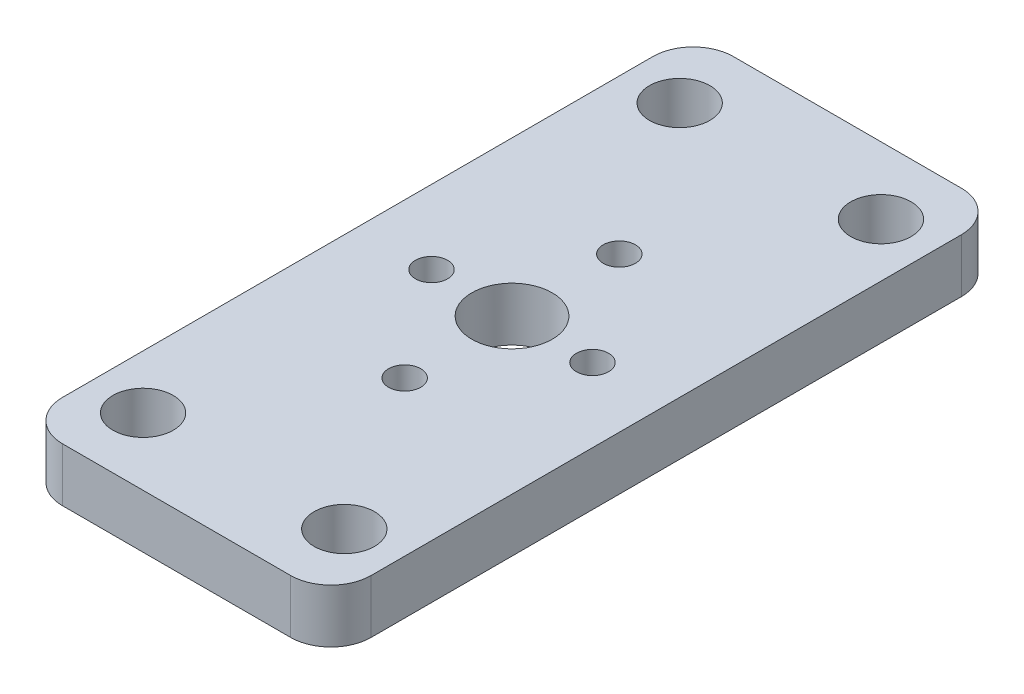
ISO-10303-21;
HEADER;
FILE_DESCRIPTION(('STEP AP214'),'2;1');
FILE_NAME('part.step','',(''),(''),'','','');
FILE_SCHEMA(('AUTOMOTIVE_DESIGN { 1 0 10303 214 1 1 1 1 }'));
ENDSEC;
DATA;
#1=APPLICATION_CONTEXT('core data for automotive mechanical design processes');
#2=APPLICATION_PROTOCOL_DEFINITION('international standard','automotive_design',2000,#1);
#3=PRODUCT_CONTEXT('',#1,'mechanical');
#4=PRODUCT('Part','Part','',(#3));
#5=PRODUCT_RELATED_PRODUCT_CATEGORY('part','',(#4));
#6=PRODUCT_DEFINITION_FORMATION('','',#4);
#7=PRODUCT_DEFINITION_CONTEXT('part definition',#1,'design');
#8=PRODUCT_DEFINITION('design','',#6,#7);
#9=PRODUCT_DEFINITION_SHAPE('','',#8);
#10=(LENGTH_UNIT() NAMED_UNIT(*) SI_UNIT(.MILLI.,.METRE.));
#11=(NAMED_UNIT(*) PLANE_ANGLE_UNIT() SI_UNIT($,.RADIAN.));
#12=(NAMED_UNIT(*) SI_UNIT($,.STERADIAN.) SOLID_ANGLE_UNIT());
#13=UNCERTAINTY_MEASURE_WITH_UNIT(LENGTH_MEASURE(1.E-05),#10,'distance_accuracy_value','');
#14=(GEOMETRIC_REPRESENTATION_CONTEXT(3) GLOBAL_UNCERTAINTY_ASSIGNED_CONTEXT((#13)) GLOBAL_UNIT_ASSIGNED_CONTEXT((#10,
#11,#12)) REPRESENTATION_CONTEXT('',''));
#15=CARTESIAN_POINT('',(0.,0.,0.));
#16=DIRECTION('',(0.,0.,1.));
#17=DIRECTION('',(1.,0.,0.));
#18=AXIS2_PLACEMENT_3D('',#15,#16,#17);
#19=CARTESIAN_POINT('',(0.,4.,0.));
#20=DIRECTION('',(0.,-1.,0.));
#21=DIRECTION('',(0.,0.,-1.));
#22=AXIS2_PLACEMENT_3D('',#19,#20,#21);
#23=PLANE('',#22);
#24=CARTESIAN_POINT('',(0.,4.,8.));
#25=DIRECTION('',(0.,-1.,0.));
#26=DIRECTION('',(0.,0.,-1.));
#27=AXIS2_PLACEMENT_3D('',#24,#25,#26);
#28=CIRCLE('',#27,1.2);
#29=CARTESIAN_POINT('',(0.,4.,6.8));
#30=VERTEX_POINT('',#29);
#31=EDGE_CURVE('E309',#30,#30,#28,.T.);
#32=ORIENTED_EDGE('',*,*,#31,.T.);
#33=EDGE_LOOP('',(#32));
#34=FACE_BOUND('',#33,.T.);
#35=CARTESIAN_POINT('',(6.,4.,0.));
#36=DIRECTION('',(0.,-1.,0.));
#37=DIRECTION('',(0.,0.,-1.));
#38=AXIS2_PLACEMENT_3D('',#35,#36,#37);
#39=CIRCLE('',#38,1.2);
#40=CARTESIAN_POINT('',(6.,4.,-1.2));
#41=VERTEX_POINT('',#40);
#42=EDGE_CURVE('E324',#41,#41,#39,.T.);
#43=ORIENTED_EDGE('',*,*,#42,.T.);
#44=EDGE_LOOP('',(#43));
#45=FACE_BOUND('',#44,.T.);
#46=CARTESIAN_POINT('',(0.,4.,-8.));
#47=DIRECTION('',(0.,-1.,0.));
#48=DIRECTION('',(0.,0.,-1.));
#49=AXIS2_PLACEMENT_3D('',#46,#47,#48);
#50=CIRCLE('',#49,1.2);
#51=CARTESIAN_POINT('',(0.,4.,-9.2));
#52=VERTEX_POINT('',#51);
#53=EDGE_CURVE('E340',#52,#52,#50,.T.);
#54=ORIENTED_EDGE('',*,*,#53,.T.);
#55=EDGE_LOOP('',(#54));
#56=FACE_BOUND('',#55,.T.);
#57=CARTESIAN_POINT('',(-6.,4.,0.));
#58=DIRECTION('',(0.,-1.,0.));
#59=DIRECTION('',(0.,0.,-1.));
#60=AXIS2_PLACEMENT_3D('',#57,#58,#59);
#61=CIRCLE('',#60,1.2);
#62=CARTESIAN_POINT('',(-6.,4.,-1.2));
#63=VERTEX_POINT('',#62);
#64=EDGE_CURVE('E356',#63,#63,#61,.T.);
#65=ORIENTED_EDGE('',*,*,#64,.T.);
#66=EDGE_LOOP('',(#65));
#67=FACE_BOUND('',#66,.T.);
#68=CARTESIAN_POINT('',(0.,4.,0.));
#69=DIRECTION('',(0.,-1.,0.));
#70=DIRECTION('',(0.,0.,-1.));
#71=AXIS2_PLACEMENT_3D('',#68,#69,#70);
#72=CIRCLE('',#71,3.);
#73=CARTESIAN_POINT('',(0.,4.,-3.));
#74=VERTEX_POINT('',#73);
#75=EDGE_CURVE('E364',#74,#74,#72,.F.);
#76=ORIENTED_EDGE('',*,*,#75,.F.);
#77=EDGE_LOOP('',(#76));
#78=FACE_BOUND('',#77,.T.);
#79=CARTESIAN_POINT('',(7.50000000000001,4.,-20.));
#80=DIRECTION('',(0.,1.,0.));
#81=DIRECTION('',(0.,0.,1.));
#82=AXIS2_PLACEMENT_3D('',#79,#80,#81);
#83=CIRCLE('',#82,2.25);
#84=CARTESIAN_POINT('',(7.50000000000001,4.,-17.75));
#85=VERTEX_POINT('',#84);
#86=EDGE_CURVE('E376',#85,#85,#83,.T.);
#87=ORIENTED_EDGE('',*,*,#86,.F.);
#88=EDGE_LOOP('',(#87));
#89=FACE_BOUND('',#88,.T.);
#90=CARTESIAN_POINT('',(-7.5,4.,20.));
#91=DIRECTION('',(0.,1.,0.));
#92=DIRECTION('',(0.,0.,1.));
#93=AXIS2_PLACEMENT_3D('',#90,#91,#92);
#94=CIRCLE('',#93,2.25);
#95=CARTESIAN_POINT('',(-7.5,4.,22.25));
#96=VERTEX_POINT('',#95);
#97=EDGE_CURVE('E384',#96,#96,#94,.T.);
#98=ORIENTED_EDGE('',*,*,#97,.F.);
#99=EDGE_LOOP('',(#98));
#100=FACE_BOUND('',#99,.T.);
#101=DIRECTION('',(0.,0.,1.));
#102=VECTOR('',#101,1.);
#103=CARTESIAN_POINT('',(-11.5,4.,25.));
#104=LINE('',#103,#102);
#105=CARTESIAN_POINT('',(-11.5,4.,-22.));
#106=VERTEX_POINT('',#105);
#107=CARTESIAN_POINT('',(-11.5,4.,22.));
#108=VERTEX_POINT('',#107);
#109=EDGE_CURVE('E180',#106,#108,#104,.T.);
#110=ORIENTED_EDGE('',*,*,#109,.T.);
#111=CARTESIAN_POINT('',(-8.49999999999999,4.,22.));
#112=DIRECTION('',(0.,-1.,0.));
#113=DIRECTION('',(0.,0.,-1.));
#114=AXIS2_PLACEMENT_3D('',#111,#112,#113);
#115=CIRCLE('',#114,3.);
#116=CARTESIAN_POINT('',(-8.49999999999999,4.,25.));
#117=VERTEX_POINT('',#116);
#118=EDGE_CURVE('E168',#108,#117,#115,.F.);
#119=ORIENTED_EDGE('',*,*,#118,.T.);
#120=DIRECTION('',(1.,0.,0.));
#121=VECTOR('',#120,1.);
#122=CARTESIAN_POINT('',(-11.5,4.,25.));
#123=LINE('',#122,#121);
#124=CARTESIAN_POINT('',(8.5,4.,25.));
#125=VERTEX_POINT('',#124);
#126=EDGE_CURVE('E126',#117,#125,#123,.T.);
#127=ORIENTED_EDGE('',*,*,#126,.T.);
#128=CARTESIAN_POINT('',(8.5,4.,22.));
#129=DIRECTION('',(0.,-1.,0.));
#130=DIRECTION('',(0.,0.,-1.));
#131=AXIS2_PLACEMENT_3D('',#128,#129,#130);
#132=CIRCLE('',#131,3.);
#133=CARTESIAN_POINT('',(11.5,4.,22.));
#134=VERTEX_POINT('',#133);
#135=EDGE_CURVE('E165',#125,#134,#132,.F.);
#136=ORIENTED_EDGE('',*,*,#135,.T.);
#137=DIRECTION('',(0.,0.,-1.));
#138=VECTOR('',#137,1.);
#139=CARTESIAN_POINT('',(11.5,4.,25.));
#140=LINE('',#139,#138);
#141=CARTESIAN_POINT('',(11.5,4.,-22.));
#142=VERTEX_POINT('',#141);
#143=EDGE_CURVE('E135',#134,#142,#140,.T.);
#144=ORIENTED_EDGE('',*,*,#143,.T.);
#145=CARTESIAN_POINT('',(8.5,4.,-22.));
#146=DIRECTION('',(0.,-1.,0.));
#147=DIRECTION('',(0.,0.,-1.));
#148=AXIS2_PLACEMENT_3D('',#145,#146,#147);
#149=CIRCLE('',#148,3.);
#150=CARTESIAN_POINT('',(8.5,4.,-25.));
#151=VERTEX_POINT('',#150);
#152=EDGE_CURVE('E60',#142,#151,#149,.F.);
#153=ORIENTED_EDGE('',*,*,#152,.T.);
#154=DIRECTION('',(-1.,0.,0.));
#155=VECTOR('',#154,1.);
#156=CARTESIAN_POINT('',(-11.5,4.,-25.));
#157=LINE('',#156,#155);
#158=CARTESIAN_POINT('',(-8.49999999999999,4.,-25.));
#159=VERTEX_POINT('',#158);
#160=EDGE_CURVE('E140',#151,#159,#157,.T.);
#161=ORIENTED_EDGE('',*,*,#160,.T.);
#162=CARTESIAN_POINT('',(-8.49999999999999,4.,-22.));
#163=DIRECTION('',(0.,-1.,0.));
#164=DIRECTION('',(0.,0.,-1.));
#165=AXIS2_PLACEMENT_3D('',#162,#163,#164);
#166=CIRCLE('',#165,3.);
#167=EDGE_CURVE('E160',#159,#106,#166,.F.);
#168=ORIENTED_EDGE('',*,*,#167,.T.);
#169=EDGE_LOOP('',(#110,#119,#127,#136,#144,#153,#161,#168));
#170=FACE_BOUND('',#169,.T.);
#171=CARTESIAN_POINT('',(7.50000000000001,4.,20.));
#172=DIRECTION('',(0.,1.,0.));
#173=DIRECTION('',(0.,0.,1.));
#174=AXIS2_PLACEMENT_3D('',#171,#172,#173);
#175=CIRCLE('',#174,2.25);
#176=CARTESIAN_POINT('',(7.50000000000001,4.,22.25));
#177=VERTEX_POINT('',#176);
#178=EDGE_CURVE('E392',#177,#177,#175,.T.);
#179=ORIENTED_EDGE('',*,*,#178,.F.);
#180=EDGE_LOOP('',(#179));
#181=FACE_BOUND('',#180,.T.);
#182=CARTESIAN_POINT('',(-7.5,4.,-20.));
#183=DIRECTION('',(0.,1.,0.));
#184=DIRECTION('',(0.,0.,1.));
#185=AXIS2_PLACEMENT_3D('',#182,#183,#184);
#186=CIRCLE('',#185,2.25);
#187=CARTESIAN_POINT('',(-7.5,4.,-17.75));
#188=VERTEX_POINT('',#187);
#189=EDGE_CURVE('E368',#188,#188,#186,.T.);
#190=ORIENTED_EDGE('',*,*,#189,.F.);
#191=EDGE_LOOP('',(#190));
#192=FACE_BOUND('',#191,.T.);
#193=ADVANCED_FACE('F38',(#34,#45,#56,#67,#78,#89,#100,#170,#181,#192),#23,.F.);
#194=CARTESIAN_POINT('',(0.,0.,0.));
#195=DIRECTION('',(0.,-1.,0.));
#196=DIRECTION('',(0.,0.,-1.));
#197=AXIS2_PLACEMENT_3D('',#194,#195,#196);
#198=PLANE('',#197);
#199=CARTESIAN_POINT('',(0.,0.,8.));
#200=DIRECTION('',(0.,-1.,0.));
#201=DIRECTION('',(0.,0.,-1.));
#202=AXIS2_PLACEMENT_3D('',#199,#200,#201);
#203=CIRCLE('',#202,2.5);
#204=CARTESIAN_POINT('',(0.,0.,5.5));
#205=VERTEX_POINT('',#204);
#206=EDGE_CURVE('E299',#205,#205,#203,.T.);
#207=ORIENTED_EDGE('',*,*,#206,.F.);
#208=EDGE_LOOP('',(#207));
#209=FACE_BOUND('',#208,.T.);
#210=CARTESIAN_POINT('',(6.,0.,0.));
#211=DIRECTION('',(0.,-1.,0.));
#212=DIRECTION('',(0.,0.,-1.));
#213=AXIS2_PLACEMENT_3D('',#210,#211,#212);
#214=CIRCLE('',#213,2.5);
#215=CARTESIAN_POINT('',(6.,0.,-2.5));
#216=VERTEX_POINT('',#215);
#217=EDGE_CURVE('E312',#216,#216,#214,.T.);
#218=ORIENTED_EDGE('',*,*,#217,.F.);
#219=EDGE_LOOP('',(#218));
#220=FACE_BOUND('',#219,.T.);
#221=CARTESIAN_POINT('',(0.,0.,-8.));
#222=DIRECTION('',(0.,-1.,0.));
#223=DIRECTION('',(0.,0.,-1.));
#224=AXIS2_PLACEMENT_3D('',#221,#222,#223);
#225=CIRCLE('',#224,2.5);
#226=CARTESIAN_POINT('',(0.,0.,-10.5));
#227=VERTEX_POINT('',#226);
#228=EDGE_CURVE('E328',#227,#227,#225,.T.);
#229=ORIENTED_EDGE('',*,*,#228,.F.);
#230=EDGE_LOOP('',(#229));
#231=FACE_BOUND('',#230,.T.);
#232=CARTESIAN_POINT('',(-6.,0.,0.));
#233=DIRECTION('',(0.,-1.,0.));
#234=DIRECTION('',(0.,0.,-1.));
#235=AXIS2_PLACEMENT_3D('',#232,#233,#234);
#236=CIRCLE('',#235,2.5);
#237=CARTESIAN_POINT('',(-6.,0.,-2.5));
#238=VERTEX_POINT('',#237);
#239=EDGE_CURVE('E344',#238,#238,#236,.T.);
#240=ORIENTED_EDGE('',*,*,#239,.F.);
#241=EDGE_LOOP('',(#240));
#242=FACE_BOUND('',#241,.T.);
#243=CARTESIAN_POINT('',(0.,0.,0.));
#244=DIRECTION('',(0.,1.,0.));
#245=DIRECTION('',(0.,0.,1.));
#246=AXIS2_PLACEMENT_3D('',#243,#244,#245);
#247=CIRCLE('',#246,3.);
#248=CARTESIAN_POINT('',(0.,0.,3.));
#249=VERTEX_POINT('',#248);
#250=EDGE_CURVE('E360',#249,#249,#247,.T.);
#251=ORIENTED_EDGE('',*,*,#250,.T.);
#252=EDGE_LOOP('',(#251));
#253=FACE_BOUND('',#252,.T.);
#254=CARTESIAN_POINT('',(-7.5,0.,-20.));
#255=DIRECTION('',(0.,1.,0.));
#256=DIRECTION('',(0.,0.,1.));
#257=AXIS2_PLACEMENT_3D('',#254,#255,#256);
#258=CIRCLE('',#257,2.25);
#259=CARTESIAN_POINT('',(-7.5,0.,-17.75));
#260=VERTEX_POINT('',#259);
#261=EDGE_CURVE('E372',#260,#260,#258,.T.);
#262=ORIENTED_EDGE('',*,*,#261,.T.);
#263=EDGE_LOOP('',(#262));
#264=FACE_BOUND('',#263,.T.);
#265=CARTESIAN_POINT('',(7.50000000000001,0.,-20.));
#266=DIRECTION('',(0.,1.,0.));
#267=DIRECTION('',(0.,0.,1.));
#268=AXIS2_PLACEMENT_3D('',#265,#266,#267);
#269=CIRCLE('',#268,2.25);
#270=CARTESIAN_POINT('',(7.50000000000001,0.,-17.75));
#271=VERTEX_POINT('',#270);
#272=EDGE_CURVE('E380',#271,#271,#269,.T.);
#273=ORIENTED_EDGE('',*,*,#272,.T.);
#274=EDGE_LOOP('',(#273));
#275=FACE_BOUND('',#274,.T.);
#276=CARTESIAN_POINT('',(-7.5,0.,20.));
#277=DIRECTION('',(0.,1.,0.));
#278=DIRECTION('',(0.,0.,1.));
#279=AXIS2_PLACEMENT_3D('',#276,#277,#278);
#280=CIRCLE('',#279,2.25);
#281=CARTESIAN_POINT('',(-7.5,0.,22.25));
#282=VERTEX_POINT('',#281);
#283=EDGE_CURVE('E388',#282,#282,#280,.T.);
#284=ORIENTED_EDGE('',*,*,#283,.T.);
#285=EDGE_LOOP('',(#284));
#286=FACE_BOUND('',#285,.T.);
#287=DIRECTION('',(1.,0.,0.));
#288=VECTOR('',#287,1.);
#289=CARTESIAN_POINT('',(-11.5,0.,25.));
#290=LINE('',#289,#288);
#291=CARTESIAN_POINT('',(-8.49999999999999,0.,25.));
#292=VERTEX_POINT('',#291);
#293=CARTESIAN_POINT('',(8.5,0.,25.));
#294=VERTEX_POINT('',#293);
#295=EDGE_CURVE('E123',#292,#294,#290,.T.);
#296=ORIENTED_EDGE('',*,*,#295,.F.);
#297=CARTESIAN_POINT('',(-8.49999999999999,0.,22.));
#298=DIRECTION('',(0.,-1.,0.));
#299=DIRECTION('',(0.,0.,-1.));
#300=AXIS2_PLACEMENT_3D('',#297,#298,#299);
#301=CIRCLE('',#300,3.);
#302=CARTESIAN_POINT('',(-11.5,0.,22.));
#303=VERTEX_POINT('',#302);
#304=EDGE_CURVE('E105',#292,#303,#301,.T.);
#305=ORIENTED_EDGE('',*,*,#304,.T.);
#306=DIRECTION('',(0.,0.,1.));
#307=VECTOR('',#306,1.);
#308=CARTESIAN_POINT('',(-11.5,0.,25.));
#309=LINE('',#308,#307);
#310=CARTESIAN_POINT('',(-11.5,0.,-22.));
#311=VERTEX_POINT('',#310);
#312=EDGE_CURVE('E136',#311,#303,#309,.T.);
#313=ORIENTED_EDGE('',*,*,#312,.F.);
#314=CARTESIAN_POINT('',(-8.49999999999999,0.,-22.));
#315=DIRECTION('',(0.,-1.,0.));
#316=DIRECTION('',(0.,0.,-1.));
#317=AXIS2_PLACEMENT_3D('',#314,#315,#316);
#318=CIRCLE('',#317,3.);
#319=CARTESIAN_POINT('',(-8.49999999999999,0.,-25.));
#320=VERTEX_POINT('',#319);
#321=EDGE_CURVE('E128',#311,#320,#318,.T.);
#322=ORIENTED_EDGE('',*,*,#321,.T.);
#323=DIRECTION('',(-1.,0.,0.));
#324=VECTOR('',#323,1.);
#325=CARTESIAN_POINT('',(-11.5,0.,-25.));
#326=LINE('',#325,#324);
#327=CARTESIAN_POINT('',(8.5,0.,-25.));
#328=VERTEX_POINT('',#327);
#329=EDGE_CURVE('E142',#328,#320,#326,.T.);
#330=ORIENTED_EDGE('',*,*,#329,.F.);
#331=CARTESIAN_POINT('',(8.5,0.,-22.));
#332=DIRECTION('',(0.,-1.,0.));
#333=DIRECTION('',(0.,0.,-1.));
#334=AXIS2_PLACEMENT_3D('',#331,#332,#333);
#335=CIRCLE('',#334,3.);
#336=CARTESIAN_POINT('',(11.5,0.,-22.));
#337=VERTEX_POINT('',#336);
#338=EDGE_CURVE('E150',#328,#337,#335,.T.);
#339=ORIENTED_EDGE('',*,*,#338,.T.);
#340=DIRECTION('',(0.,0.,-1.));
#341=VECTOR('',#340,1.);
#342=CARTESIAN_POINT('',(11.5,0.,25.));
#343=LINE('',#342,#341);
#344=CARTESIAN_POINT('',(11.5,0.,22.));
#345=VERTEX_POINT('',#344);
#346=EDGE_CURVE('E189',#345,#337,#343,.T.);
#347=ORIENTED_EDGE('',*,*,#346,.F.);
#348=CARTESIAN_POINT('',(8.5,0.,22.));
#349=DIRECTION('',(0.,-1.,0.));
#350=DIRECTION('',(0.,0.,-1.));
#351=AXIS2_PLACEMENT_3D('',#348,#349,#350);
#352=CIRCLE('',#351,3.);
#353=EDGE_CURVE('E117',#345,#294,#352,.T.);
#354=ORIENTED_EDGE('',*,*,#353,.T.);
#355=EDGE_LOOP('',(#296,#305,#313,#322,#330,#339,#347,#354));
#356=FACE_BOUND('',#355,.T.);
#357=CARTESIAN_POINT('',(7.50000000000001,0.,20.));
#358=DIRECTION('',(0.,1.,0.));
#359=DIRECTION('',(0.,0.,1.));
#360=AXIS2_PLACEMENT_3D('',#357,#358,#359);
#361=CIRCLE('',#360,2.25);
#362=CARTESIAN_POINT('',(7.50000000000001,0.,22.25));
#363=VERTEX_POINT('',#362);
#364=EDGE_CURVE('E192',#363,#363,#361,.T.);
#365=ORIENTED_EDGE('',*,*,#364,.T.);
#366=EDGE_LOOP('',(#365));
#367=FACE_BOUND('',#366,.T.);
#368=ADVANCED_FACE('F131',(#209,#220,#231,#242,#253,#264,#275,#286,#356,#367),#198,.T.);
#369=CARTESIAN_POINT('',(11.5,4.,25.));
#370=DIRECTION('',(-1.,0.,0.));
#371=DIRECTION('',(0.,0.,1.));
#372=AXIS2_PLACEMENT_3D('',#369,#370,#371);
#373=PLANE('',#372);
#374=ORIENTED_EDGE('',*,*,#143,.F.);
#375=DIRECTION('',(0.,-1.,0.));
#376=VECTOR('',#375,1.);
#377=CARTESIAN_POINT('',(11.5,4.,22.));
#378=LINE('',#377,#376);
#379=EDGE_CURVE('E174',#134,#345,#378,.T.);
#380=ORIENTED_EDGE('',*,*,#379,.T.);
#381=ORIENTED_EDGE('',*,*,#346,.T.);
#382=DIRECTION('',(0.,-1.,0.));
#383=VECTOR('',#382,1.);
#384=CARTESIAN_POINT('',(11.5,4.,-22.));
#385=LINE('',#384,#383);
#386=EDGE_CURVE('E171',#337,#142,#385,.F.);
#387=ORIENTED_EDGE('',*,*,#386,.T.);
#388=EDGE_LOOP('',(#374,#380,#381,#387));
#389=FACE_BOUND('',#388,.T.);
#390=ADVANCED_FACE('F211',(#389),#373,.F.);
#391=CARTESIAN_POINT('',(-11.5,4.,-25.));
#392=DIRECTION('',(0.,0.,1.));
#393=DIRECTION('',(1.,0.,0.));
#394=AXIS2_PLACEMENT_3D('',#391,#392,#393);
#395=PLANE('',#394);
#396=ORIENTED_EDGE('',*,*,#160,.F.);
#397=DIRECTION('',(0.,-1.,0.));
#398=VECTOR('',#397,1.);
#399=CARTESIAN_POINT('',(8.5,4.,-25.));
#400=LINE('',#399,#398);
#401=EDGE_CURVE('E11',#151,#328,#400,.T.);
#402=ORIENTED_EDGE('',*,*,#401,.T.);
#403=ORIENTED_EDGE('',*,*,#329,.T.);
#404=DIRECTION('',(0.,-1.,0.));
#405=VECTOR('',#404,1.);
#406=CARTESIAN_POINT('',(-8.49999999999999,4.,-25.));
#407=LINE('',#406,#405);
#408=EDGE_CURVE('E47',#320,#159,#407,.F.);
#409=ORIENTED_EDGE('',*,*,#408,.T.);
#410=EDGE_LOOP('',(#396,#402,#403,#409));
#411=FACE_BOUND('',#410,.T.);
#412=ADVANCED_FACE('F195',(#411),#395,.F.);
#413=CARTESIAN_POINT('',(-11.5,4.,25.));
#414=DIRECTION('',(1.,0.,0.));
#415=DIRECTION('',(0.,0.,-1.));
#416=AXIS2_PLACEMENT_3D('',#413,#414,#415);
#417=PLANE('',#416);
#418=ORIENTED_EDGE('',*,*,#312,.T.);
#419=DIRECTION('',(0.,-1.,0.));
#420=VECTOR('',#419,1.);
#421=CARTESIAN_POINT('',(-11.5,4.,22.));
#422=LINE('',#421,#420);
#423=EDGE_CURVE('E110',#303,#108,#422,.F.);
#424=ORIENTED_EDGE('',*,*,#423,.T.);
#425=ORIENTED_EDGE('',*,*,#109,.F.);
#426=DIRECTION('',(0.,-1.,0.));
#427=VECTOR('',#426,1.);
#428=CARTESIAN_POINT('',(-11.5,4.,-22.));
#429=LINE('',#428,#427);
#430=EDGE_CURVE('E116',#106,#311,#429,.T.);
#431=ORIENTED_EDGE('',*,*,#430,.T.);
#432=EDGE_LOOP('',(#418,#424,#425,#431));
#433=FACE_BOUND('',#432,.T.);
#434=ADVANCED_FACE('F202',(#433),#417,.F.);
#435=CARTESIAN_POINT('',(-11.5,4.,25.));
#436=DIRECTION('',(0.,0.,-1.));
#437=DIRECTION('',(-1.,0.,0.));
#438=AXIS2_PLACEMENT_3D('',#435,#436,#437);
#439=PLANE('',#438);
#440=ORIENTED_EDGE('',*,*,#126,.F.);
#441=DIRECTION('',(0.,-1.,0.));
#442=VECTOR('',#441,1.);
#443=CARTESIAN_POINT('',(-8.49999999999999,4.,25.));
#444=LINE('',#443,#442);
#445=EDGE_CURVE('E109',#117,#292,#444,.T.);
#446=ORIENTED_EDGE('',*,*,#445,.T.);
#447=ORIENTED_EDGE('',*,*,#295,.T.);
#448=DIRECTION('',(0.,-1.,0.));
#449=VECTOR('',#448,1.);
#450=CARTESIAN_POINT('',(8.5,4.,25.));
#451=LINE('',#450,#449);
#452=EDGE_CURVE('E129',#294,#125,#451,.F.);
#453=ORIENTED_EDGE('',*,*,#452,.T.);
#454=EDGE_LOOP('',(#440,#446,#447,#453));
#455=FACE_BOUND('',#454,.T.);
#456=ADVANCED_FACE('F122',(#455),#439,.F.);
#457=CARTESIAN_POINT('',(7.50000000000001,4.,20.));
#458=DIRECTION('',(0.,1.,0.));
#459=DIRECTION('',(0.,0.,1.));
#460=AXIS2_PLACEMENT_3D('',#457,#458,#459);
#461=CYLINDRICAL_SURFACE('',#460,2.25);
#462=ORIENTED_EDGE('',*,*,#364,.F.);
#463=EDGE_LOOP('',(#462));
#464=FACE_BOUND('',#463,.T.);
#465=ORIENTED_EDGE('',*,*,#178,.T.);
#466=EDGE_LOOP('',(#465));
#467=FACE_BOUND('',#466,.T.);
#468=ADVANCED_FACE('F209',(#464,#467),#461,.F.);
#469=CARTESIAN_POINT('',(-7.5,4.,20.));
#470=DIRECTION('',(0.,1.,0.));
#471=DIRECTION('',(0.,0.,1.));
#472=AXIS2_PLACEMENT_3D('',#469,#470,#471);
#473=CYLINDRICAL_SURFACE('',#472,2.25);
#474=ORIENTED_EDGE('',*,*,#283,.F.);
#475=EDGE_LOOP('',(#474));
#476=FACE_BOUND('',#475,.T.);
#477=ORIENTED_EDGE('',*,*,#97,.T.);
#478=EDGE_LOOP('',(#477));
#479=FACE_BOUND('',#478,.T.);
#480=ADVANCED_FACE('F227',(#476,#479),#473,.F.);
#481=CARTESIAN_POINT('',(7.50000000000001,4.,-20.));
#482=DIRECTION('',(0.,1.,0.));
#483=DIRECTION('',(0.,0.,1.));
#484=AXIS2_PLACEMENT_3D('',#481,#482,#483);
#485=CYLINDRICAL_SURFACE('',#484,2.25);
#486=ORIENTED_EDGE('',*,*,#272,.F.);
#487=EDGE_LOOP('',(#486));
#488=FACE_BOUND('',#487,.T.);
#489=ORIENTED_EDGE('',*,*,#86,.T.);
#490=EDGE_LOOP('',(#489));
#491=FACE_BOUND('',#490,.T.);
#492=ADVANCED_FACE('F231',(#488,#491),#485,.F.);
#493=CARTESIAN_POINT('',(-7.5,4.,-20.));
#494=DIRECTION('',(0.,1.,0.));
#495=DIRECTION('',(0.,0.,1.));
#496=AXIS2_PLACEMENT_3D('',#493,#494,#495);
#497=CYLINDRICAL_SURFACE('',#496,2.25);
#498=ORIENTED_EDGE('',*,*,#261,.F.);
#499=EDGE_LOOP('',(#498));
#500=FACE_BOUND('',#499,.T.);
#501=ORIENTED_EDGE('',*,*,#189,.T.);
#502=EDGE_LOOP('',(#501));
#503=FACE_BOUND('',#502,.T.);
#504=ADVANCED_FACE('F235',(#500,#503),#497,.F.);
#505=CARTESIAN_POINT('',(-8.49999999999999,4.,22.));
#506=DIRECTION('',(0.,-1.,0.));
#507=DIRECTION('',(0.,0.,-1.));
#508=AXIS2_PLACEMENT_3D('',#505,#506,#507);
#509=CYLINDRICAL_SURFACE('',#508,3.);
#510=ORIENTED_EDGE('',*,*,#118,.F.);
#511=ORIENTED_EDGE('',*,*,#423,.F.);
#512=ORIENTED_EDGE('',*,*,#304,.F.);
#513=ORIENTED_EDGE('',*,*,#445,.F.);
#514=EDGE_LOOP('',(#510,#511,#512,#513));
#515=FACE_BOUND('',#514,.T.);
#516=ADVANCED_FACE('F108',(#515),#509,.T.);
#517=CARTESIAN_POINT('',(8.5,4.,22.));
#518=DIRECTION('',(0.,-1.,0.));
#519=DIRECTION('',(0.,0.,-1.));
#520=AXIS2_PLACEMENT_3D('',#517,#518,#519);
#521=CYLINDRICAL_SURFACE('',#520,3.);
#522=ORIENTED_EDGE('',*,*,#135,.F.);
#523=ORIENTED_EDGE('',*,*,#452,.F.);
#524=ORIENTED_EDGE('',*,*,#353,.F.);
#525=ORIENTED_EDGE('',*,*,#379,.F.);
#526=EDGE_LOOP('',(#522,#523,#524,#525));
#527=FACE_BOUND('',#526,.T.);
#528=ADVANCED_FACE('F509',(#527),#521,.T.);
#529=CARTESIAN_POINT('',(8.5,4.,-22.));
#530=DIRECTION('',(0.,-1.,0.));
#531=DIRECTION('',(0.,0.,-1.));
#532=AXIS2_PLACEMENT_3D('',#529,#530,#531);
#533=CYLINDRICAL_SURFACE('',#532,3.);
#534=ORIENTED_EDGE('',*,*,#152,.F.);
#535=ORIENTED_EDGE('',*,*,#386,.F.);
#536=ORIENTED_EDGE('',*,*,#338,.F.);
#537=ORIENTED_EDGE('',*,*,#401,.F.);
#538=EDGE_LOOP('',(#534,#535,#536,#537));
#539=FACE_BOUND('',#538,.T.);
#540=ADVANCED_FACE('F503',(#539),#533,.T.);
#541=CARTESIAN_POINT('',(-8.49999999999999,4.,-22.));
#542=DIRECTION('',(0.,-1.,0.));
#543=DIRECTION('',(0.,0.,-1.));
#544=AXIS2_PLACEMENT_3D('',#541,#542,#543);
#545=CYLINDRICAL_SURFACE('',#544,3.);
#546=ORIENTED_EDGE('',*,*,#167,.F.);
#547=ORIENTED_EDGE('',*,*,#408,.F.);
#548=ORIENTED_EDGE('',*,*,#321,.F.);
#549=ORIENTED_EDGE('',*,*,#430,.F.);
#550=EDGE_LOOP('',(#546,#547,#548,#549));
#551=FACE_BOUND('',#550,.T.);
#552=ADVANCED_FACE('F40',(#551),#545,.T.);
#553=CARTESIAN_POINT('',(0.,10.,0.));
#554=DIRECTION('',(0.,-1.,0.));
#555=DIRECTION('',(0.,0.,-1.));
#556=AXIS2_PLACEMENT_3D('',#553,#554,#555);
#557=CYLINDRICAL_SURFACE('',#556,3.);
#558=ORIENTED_EDGE('',*,*,#250,.F.);
#559=EDGE_LOOP('',(#558));
#560=FACE_BOUND('',#559,.T.);
#561=ORIENTED_EDGE('',*,*,#75,.T.);
#562=EDGE_LOOP('',(#561));
#563=FACE_BOUND('',#562,.T.);
#564=ADVANCED_FACE('F240',(#560,#563),#557,.F.);
#565=CARTESIAN_POINT('',(-6.,0.,0.));
#566=DIRECTION('',(0.,-1.,0.));
#567=DIRECTION('',(0.,0.,-1.));
#568=AXIS2_PLACEMENT_3D('',#565,#566,#567);
#569=CYLINDRICAL_SURFACE('',#568,1.2);
#570=ORIENTED_EDGE('',*,*,#64,.F.);
#571=EDGE_LOOP('',(#570));
#572=FACE_BOUND('',#571,.T.);
#573=CARTESIAN_POINT('',(-6.,1.6,0.));
#574=DIRECTION('',(0.,-1.,0.));
#575=DIRECTION('',(0.,0.,-1.));
#576=AXIS2_PLACEMENT_3D('',#573,#574,#575);
#577=CIRCLE('',#576,1.2);
#578=CARTESIAN_POINT('',(-6.,1.6,-1.2));
#579=VERTEX_POINT('',#578);
#580=EDGE_CURVE('E352',#579,#579,#577,.T.);
#581=ORIENTED_EDGE('',*,*,#580,.T.);
#582=EDGE_LOOP('',(#581));
#583=FACE_BOUND('',#582,.T.);
#584=ADVANCED_FACE('F243',(#572,#583),#569,.F.);
#585=CARTESIAN_POINT('',(-4.8,1.6,0.));
#586=DIRECTION('',(0.,1.,0.));
#587=DIRECTION('',(0.,0.,1.));
#588=AXIS2_PLACEMENT_3D('',#585,#586,#587);
#589=PLANE('',#588);
#590=ORIENTED_EDGE('',*,*,#580,.F.);
#591=EDGE_LOOP('',(#590));
#592=FACE_BOUND('',#591,.T.);
#593=CARTESIAN_POINT('',(-6.,1.6,0.));
#594=DIRECTION('',(0.,-1.,0.));
#595=DIRECTION('',(0.,0.,-1.));
#596=AXIS2_PLACEMENT_3D('',#593,#594,#595);
#597=CIRCLE('',#596,2.5);
#598=CARTESIAN_POINT('',(-6.,1.6,-2.5));
#599=VERTEX_POINT('',#598);
#600=EDGE_CURVE('E348',#599,#599,#597,.T.);
#601=ORIENTED_EDGE('',*,*,#600,.T.);
#602=EDGE_LOOP('',(#601));
#603=FACE_BOUND('',#602,.T.);
#604=ADVANCED_FACE('F247',(#592,#603),#589,.F.);
#605=CARTESIAN_POINT('',(-6.,0.,0.));
#606=DIRECTION('',(0.,-1.,0.));
#607=DIRECTION('',(0.,0.,-1.));
#608=AXIS2_PLACEMENT_3D('',#605,#606,#607);
#609=CYLINDRICAL_SURFACE('',#608,2.5);
#610=ORIENTED_EDGE('',*,*,#600,.F.);
#611=EDGE_LOOP('',(#610));
#612=FACE_BOUND('',#611,.T.);
#613=ORIENTED_EDGE('',*,*,#239,.T.);
#614=EDGE_LOOP('',(#613));
#615=FACE_BOUND('',#614,.T.);
#616=ADVANCED_FACE('F251',(#612,#615),#609,.F.);
#617=CARTESIAN_POINT('',(0.,0.,-8.));
#618=DIRECTION('',(0.,-1.,0.));
#619=DIRECTION('',(0.,0.,-1.));
#620=AXIS2_PLACEMENT_3D('',#617,#618,#619);
#621=CYLINDRICAL_SURFACE('',#620,1.2);
#622=ORIENTED_EDGE('',*,*,#53,.F.);
#623=EDGE_LOOP('',(#622));
#624=FACE_BOUND('',#623,.T.);
#625=CARTESIAN_POINT('',(0.,1.6,-8.));
#626=DIRECTION('',(0.,-1.,0.));
#627=DIRECTION('',(0.,0.,-1.));
#628=AXIS2_PLACEMENT_3D('',#625,#626,#627);
#629=CIRCLE('',#628,1.2);
#630=CARTESIAN_POINT('',(0.,1.6,-9.2));
#631=VERTEX_POINT('',#630);
#632=EDGE_CURVE('E336',#631,#631,#629,.T.);
#633=ORIENTED_EDGE('',*,*,#632,.T.);
#634=EDGE_LOOP('',(#633));
#635=FACE_BOUND('',#634,.T.);
#636=ADVANCED_FACE('F255',(#624,#635),#621,.F.);
#637=CARTESIAN_POINT('',(1.2,1.6,-8.));
#638=DIRECTION('',(0.,1.,0.));
#639=DIRECTION('',(0.,0.,1.));
#640=AXIS2_PLACEMENT_3D('',#637,#638,#639);
#641=PLANE('',#640);
#642=ORIENTED_EDGE('',*,*,#632,.F.);
#643=EDGE_LOOP('',(#642));
#644=FACE_BOUND('',#643,.T.);
#645=CARTESIAN_POINT('',(0.,1.6,-8.));
#646=DIRECTION('',(0.,-1.,0.));
#647=DIRECTION('',(0.,0.,-1.));
#648=AXIS2_PLACEMENT_3D('',#645,#646,#647);
#649=CIRCLE('',#648,2.5);
#650=CARTESIAN_POINT('',(0.,1.6,-10.5));
#651=VERTEX_POINT('',#650);
#652=EDGE_CURVE('E332',#651,#651,#649,.T.);
#653=ORIENTED_EDGE('',*,*,#652,.T.);
#654=EDGE_LOOP('',(#653));
#655=FACE_BOUND('',#654,.T.);
#656=ADVANCED_FACE('F259',(#644,#655),#641,.F.);
#657=CARTESIAN_POINT('',(0.,0.,-8.));
#658=DIRECTION('',(0.,-1.,0.));
#659=DIRECTION('',(0.,0.,-1.));
#660=AXIS2_PLACEMENT_3D('',#657,#658,#659);
#661=CYLINDRICAL_SURFACE('',#660,2.5);
#662=ORIENTED_EDGE('',*,*,#652,.F.);
#663=EDGE_LOOP('',(#662));
#664=FACE_BOUND('',#663,.T.);
#665=ORIENTED_EDGE('',*,*,#228,.T.);
#666=EDGE_LOOP('',(#665));
#667=FACE_BOUND('',#666,.T.);
#668=ADVANCED_FACE('F263',(#664,#667),#661,.F.);
#669=CARTESIAN_POINT('',(6.,0.,0.));
#670=DIRECTION('',(0.,-1.,0.));
#671=DIRECTION('',(0.,0.,-1.));
#672=AXIS2_PLACEMENT_3D('',#669,#670,#671);
#673=CYLINDRICAL_SURFACE('',#672,1.2);
#674=ORIENTED_EDGE('',*,*,#42,.F.);
#675=EDGE_LOOP('',(#674));
#676=FACE_BOUND('',#675,.T.);
#677=CARTESIAN_POINT('',(6.,1.6,0.));
#678=DIRECTION('',(0.,-1.,0.));
#679=DIRECTION('',(0.,0.,-1.));
#680=AXIS2_PLACEMENT_3D('',#677,#678,#679);
#681=CIRCLE('',#680,1.2);
#682=CARTESIAN_POINT('',(6.,1.6,-1.2));
#683=VERTEX_POINT('',#682);
#684=EDGE_CURVE('E320',#683,#683,#681,.T.);
#685=ORIENTED_EDGE('',*,*,#684,.T.);
#686=EDGE_LOOP('',(#685));
#687=FACE_BOUND('',#686,.T.);
#688=ADVANCED_FACE('F267',(#676,#687),#673,.F.);
#689=CARTESIAN_POINT('',(7.2,1.6,0.));
#690=DIRECTION('',(0.,1.,0.));
#691=DIRECTION('',(0.,0.,1.));
#692=AXIS2_PLACEMENT_3D('',#689,#690,#691);
#693=PLANE('',#692);
#694=ORIENTED_EDGE('',*,*,#684,.F.);
#695=EDGE_LOOP('',(#694));
#696=FACE_BOUND('',#695,.T.);
#697=CARTESIAN_POINT('',(6.,1.6,0.));
#698=DIRECTION('',(0.,-1.,0.));
#699=DIRECTION('',(0.,0.,-1.));
#700=AXIS2_PLACEMENT_3D('',#697,#698,#699);
#701=CIRCLE('',#700,2.5);
#702=CARTESIAN_POINT('',(6.,1.6,-2.5));
#703=VERTEX_POINT('',#702);
#704=EDGE_CURVE('E316',#703,#703,#701,.T.);
#705=ORIENTED_EDGE('',*,*,#704,.T.);
#706=EDGE_LOOP('',(#705));
#707=FACE_BOUND('',#706,.T.);
#708=ADVANCED_FACE('F271',(#696,#707),#693,.F.);
#709=CARTESIAN_POINT('',(6.,0.,0.));
#710=DIRECTION('',(0.,-1.,0.));
#711=DIRECTION('',(0.,0.,-1.));
#712=AXIS2_PLACEMENT_3D('',#709,#710,#711);
#713=CYLINDRICAL_SURFACE('',#712,2.5);
#714=ORIENTED_EDGE('',*,*,#704,.F.);
#715=EDGE_LOOP('',(#714));
#716=FACE_BOUND('',#715,.T.);
#717=ORIENTED_EDGE('',*,*,#217,.T.);
#718=EDGE_LOOP('',(#717));
#719=FACE_BOUND('',#718,.T.);
#720=ADVANCED_FACE('F275',(#716,#719),#713,.F.);
#721=CARTESIAN_POINT('',(0.,0.,8.));
#722=DIRECTION('',(0.,-1.,0.));
#723=DIRECTION('',(0.,0.,-1.));
#724=AXIS2_PLACEMENT_3D('',#721,#722,#723);
#725=CYLINDRICAL_SURFACE('',#724,1.2);
#726=ORIENTED_EDGE('',*,*,#31,.F.);
#727=EDGE_LOOP('',(#726));
#728=FACE_BOUND('',#727,.T.);
#729=CARTESIAN_POINT('',(0.,1.6,8.));
#730=DIRECTION('',(0.,-1.,0.));
#731=DIRECTION('',(0.,0.,-1.));
#732=AXIS2_PLACEMENT_3D('',#729,#730,#731);
#733=CIRCLE('',#732,1.2);
#734=CARTESIAN_POINT('',(0.,1.6,6.8));
#735=VERTEX_POINT('',#734);
#736=EDGE_CURVE('E303',#735,#735,#733,.T.);
#737=ORIENTED_EDGE('',*,*,#736,.T.);
#738=EDGE_LOOP('',(#737));
#739=FACE_BOUND('',#738,.T.);
#740=ADVANCED_FACE('F279',(#728,#739),#725,.F.);
#741=CARTESIAN_POINT('',(1.2,1.6,8.));
#742=DIRECTION('',(0.,1.,0.));
#743=DIRECTION('',(0.,0.,1.));
#744=AXIS2_PLACEMENT_3D('',#741,#742,#743);
#745=PLANE('',#744);
#746=ORIENTED_EDGE('',*,*,#736,.F.);
#747=EDGE_LOOP('',(#746));
#748=FACE_BOUND('',#747,.T.);
#749=CARTESIAN_POINT('',(0.,1.6,8.));
#750=DIRECTION('',(0.,-1.,0.));
#751=DIRECTION('',(0.,0.,-1.));
#752=AXIS2_PLACEMENT_3D('',#749,#750,#751);
#753=CIRCLE('',#752,2.5);
#754=CARTESIAN_POINT('',(0.,1.6,5.5));
#755=VERTEX_POINT('',#754);
#756=EDGE_CURVE('E296',#755,#755,#753,.T.);
#757=ORIENTED_EDGE('',*,*,#756,.T.);
#758=EDGE_LOOP('',(#757));
#759=FACE_BOUND('',#758,.T.);
#760=ADVANCED_FACE('F283',(#748,#759),#745,.F.);
#761=CARTESIAN_POINT('',(0.,0.,8.));
#762=DIRECTION('',(0.,-1.,0.));
#763=DIRECTION('',(0.,0.,-1.));
#764=AXIS2_PLACEMENT_3D('',#761,#762,#763);
#765=CYLINDRICAL_SURFACE('',#764,2.5);
#766=ORIENTED_EDGE('',*,*,#756,.F.);
#767=EDGE_LOOP('',(#766));
#768=FACE_BOUND('',#767,.T.);
#769=ORIENTED_EDGE('',*,*,#206,.T.);
#770=EDGE_LOOP('',(#769));
#771=FACE_BOUND('',#770,.T.);
#772=ADVANCED_FACE('F287',(#768,#771),#765,.F.);
#773=CLOSED_SHELL('',(#193,#368,#390,#412,#434,#456,#468,#480,#492,#504,#516,#528,#540,#552,
#564,#584,#604,#616,#636,#656,#668,#688,#708,#720,#740,#760,#772));
#774=MANIFOLD_SOLID_BREP('B2',#773);
#775=ADVANCED_BREP_SHAPE_REPRESENTATION('',(#18,#774),#14);
#776=SHAPE_DEFINITION_REPRESENTATION(#9,#775);
ENDSEC;
END-ISO-10303-21;
